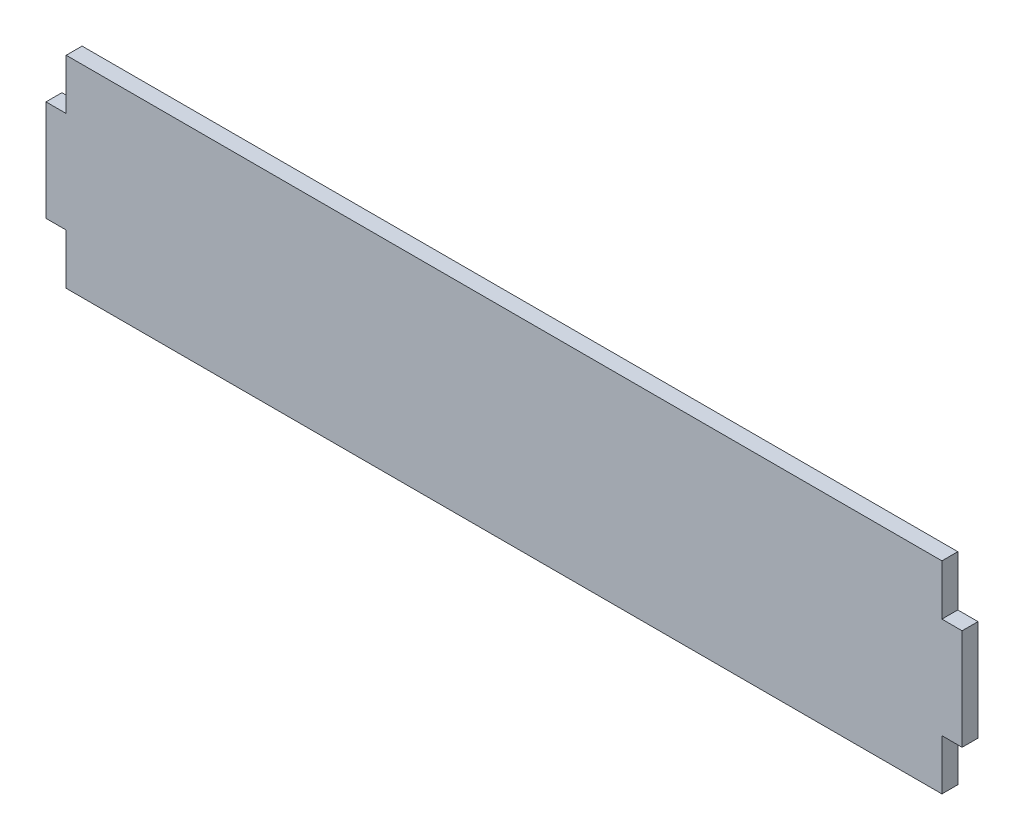
ISO-10303-21;
HEADER;
FILE_DESCRIPTION(('STEP AP214'),'2;1');
FILE_NAME('part.step','',(''),(''),'','','');
FILE_SCHEMA(('AUTOMOTIVE_DESIGN { 1 0 10303 214 1 1 1 1 }'));
ENDSEC;
DATA;
#1=APPLICATION_CONTEXT('core data for automotive mechanical design processes');
#2=APPLICATION_PROTOCOL_DEFINITION('international standard','automotive_design',2000,#1);
#3=PRODUCT_CONTEXT('',#1,'mechanical');
#4=PRODUCT('Part','Part','',(#3));
#5=PRODUCT_RELATED_PRODUCT_CATEGORY('part','',(#4));
#6=PRODUCT_DEFINITION_FORMATION('','',#4);
#7=PRODUCT_DEFINITION_CONTEXT('part definition',#1,'design');
#8=PRODUCT_DEFINITION('design','',#6,#7);
#9=PRODUCT_DEFINITION_SHAPE('','',#8);
#10=(LENGTH_UNIT() NAMED_UNIT(*) SI_UNIT(.MILLI.,.METRE.));
#11=(NAMED_UNIT(*) PLANE_ANGLE_UNIT() SI_UNIT($,.RADIAN.));
#12=(NAMED_UNIT(*) SI_UNIT($,.STERADIAN.) SOLID_ANGLE_UNIT());
#13=UNCERTAINTY_MEASURE_WITH_UNIT(LENGTH_MEASURE(1.E-05),#10,'distance_accuracy_value','');
#14=(GEOMETRIC_REPRESENTATION_CONTEXT(3) GLOBAL_UNCERTAINTY_ASSIGNED_CONTEXT((#13)) GLOBAL_UNIT_ASSIGNED_CONTEXT((#10,
#11,#12)) REPRESENTATION_CONTEXT('',''));
#15=CARTESIAN_POINT('',(0.,0.,0.));
#16=DIRECTION('',(0.,0.,1.));
#17=DIRECTION('',(1.,0.,0.));
#18=AXIS2_PLACEMENT_3D('',#15,#16,#17);
#19=CARTESIAN_POINT('',(-75.3382959521356,22.86,2.));
#20=DIRECTION('',(1.,0.,0.));
#21=DIRECTION('',(0.,0.,-1.));
#22=AXIS2_PLACEMENT_3D('',#19,#20,#21);
#23=PLANE('',#22);
#24=DIRECTION('',(0.,-1.,0.));
#25=VECTOR('',#24,1.);
#26=CARTESIAN_POINT('',(-75.3382959521356,22.86,0.));
#27=LINE('',#26,#25);
#28=CARTESIAN_POINT('',(-75.3382959521356,25.4,0.));
#29=VERTEX_POINT('',#28);
#30=CARTESIAN_POINT('',(-75.3382959521356,19.05,0.));
#31=VERTEX_POINT('',#30);
#32=EDGE_CURVE('E104',#29,#31,#27,.T.);
#33=ORIENTED_EDGE('',*,*,#32,.T.);
#34=DIRECTION('',(0.,0.,-1.));
#35=VECTOR('',#34,1.);
#36=CARTESIAN_POINT('',(-75.3382959521356,19.05,2.));
#37=LINE('',#36,#35);
#38=CARTESIAN_POINT('',(-75.3382959521356,19.05,2.));
#39=VERTEX_POINT('',#38);
#40=EDGE_CURVE('E11',#39,#31,#37,.T.);
#41=ORIENTED_EDGE('',*,*,#40,.F.);
#42=DIRECTION('',(0.,-1.,0.));
#43=VECTOR('',#42,1.);
#44=CARTESIAN_POINT('',(-75.3382959521356,22.86,2.));
#45=LINE('',#44,#43);
#46=CARTESIAN_POINT('',(-75.3382959521356,25.4,2.));
#47=VERTEX_POINT('',#46);
#48=EDGE_CURVE('E110',#47,#39,#45,.T.);
#49=ORIENTED_EDGE('',*,*,#48,.F.);
#50=DIRECTION('',(0.,0.,-1.));
#51=VECTOR('',#50,1.);
#52=CARTESIAN_POINT('',(-75.3382959521356,25.4,2.));
#53=LINE('',#52,#51);
#54=EDGE_CURVE('E157',#47,#29,#53,.T.);
#55=ORIENTED_EDGE('',*,*,#54,.T.);
#56=EDGE_LOOP('',(#33,#41,#49,#55));
#57=FACE_BOUND('',#56,.T.);
#58=ADVANCED_FACE('F41',(#57),#23,.F.);
#59=CARTESIAN_POINT('',(-77.8782959521356,19.05,2.));
#60=DIRECTION('',(0.,-1.,0.));
#61=DIRECTION('',(0.,0.,-1.));
#62=AXIS2_PLACEMENT_3D('',#59,#60,#61);
#63=PLANE('',#62);
#64=DIRECTION('',(-1.,0.,0.));
#65=VECTOR('',#64,1.);
#66=CARTESIAN_POINT('',(-77.8782959521356,19.05,0.));
#67=LINE('',#66,#65);
#68=CARTESIAN_POINT('',(-77.8782959521356,19.05,0.));
#69=VERTEX_POINT('',#68);
#70=EDGE_CURVE('E162',#31,#69,#67,.T.);
#71=ORIENTED_EDGE('',*,*,#70,.T.);
#72=DIRECTION('',(0.,0.,-1.));
#73=VECTOR('',#72,1.);
#74=CARTESIAN_POINT('',(-77.8782959521356,19.05,2.));
#75=LINE('',#74,#73);
#76=CARTESIAN_POINT('',(-77.8782959521356,19.05,2.));
#77=VERTEX_POINT('',#76);
#78=EDGE_CURVE('E49',#77,#69,#75,.T.);
#79=ORIENTED_EDGE('',*,*,#78,.F.);
#80=DIRECTION('',(-1.,0.,0.));
#81=VECTOR('',#80,1.);
#82=CARTESIAN_POINT('',(-77.8782959521356,19.05,2.));
#83=LINE('',#82,#81);
#84=EDGE_CURVE('E251',#39,#77,#83,.T.);
#85=ORIENTED_EDGE('',*,*,#84,.F.);
#86=ORIENTED_EDGE('',*,*,#40,.T.);
#87=EDGE_LOOP('',(#71,#79,#85,#86));
#88=FACE_BOUND('',#87,.T.);
#89=ADVANCED_FACE('F254',(#88),#63,.F.);
#90=CARTESIAN_POINT('',(-77.8782959521356,19.05,2.));
#91=DIRECTION('',(1.,0.,0.));
#92=DIRECTION('',(0.,0.,-1.));
#93=AXIS2_PLACEMENT_3D('',#90,#91,#92);
#94=PLANE('',#93);
#95=DIRECTION('',(0.,-1.,0.));
#96=VECTOR('',#95,1.);
#97=CARTESIAN_POINT('',(-77.8782959521356,19.05,0.));
#98=LINE('',#97,#96);
#99=CARTESIAN_POINT('',(-77.8782959521356,6.35,0.));
#100=VERTEX_POINT('',#99);
#101=EDGE_CURVE('E164',#69,#100,#98,.T.);
#102=ORIENTED_EDGE('',*,*,#101,.T.);
#103=DIRECTION('',(0.,0.,-1.));
#104=VECTOR('',#103,1.);
#105=CARTESIAN_POINT('',(-77.8782959521356,6.35,2.));
#106=LINE('',#105,#104);
#107=CARTESIAN_POINT('',(-77.8782959521356,6.35,2.));
#108=VERTEX_POINT('',#107);
#109=EDGE_CURVE('E203',#108,#100,#106,.T.);
#110=ORIENTED_EDGE('',*,*,#109,.F.);
#111=DIRECTION('',(0.,-1.,0.));
#112=VECTOR('',#111,1.);
#113=CARTESIAN_POINT('',(-77.8782959521356,19.05,2.));
#114=LINE('',#113,#112);
#115=EDGE_CURVE('E212',#77,#108,#114,.T.);
#116=ORIENTED_EDGE('',*,*,#115,.F.);
#117=ORIENTED_EDGE('',*,*,#78,.T.);
#118=EDGE_LOOP('',(#102,#110,#116,#117));
#119=FACE_BOUND('',#118,.T.);
#120=ADVANCED_FACE('F210',(#119),#94,.F.);
#121=CARTESIAN_POINT('',(-77.8782959521356,6.35,2.));
#122=DIRECTION('',(0.,1.,0.));
#123=DIRECTION('',(-1.,0.,0.));
#124=AXIS2_PLACEMENT_3D('',#121,#122,#123);
#125=PLANE('',#124);
#126=DIRECTION('',(1.,0.,0.));
#127=VECTOR('',#126,1.);
#128=CARTESIAN_POINT('',(-77.8782959521356,6.35,0.));
#129=LINE('',#128,#127);
#130=CARTESIAN_POINT('',(-75.3382959521356,6.35,0.));
#131=VERTEX_POINT('',#130);
#132=EDGE_CURVE('E166',#100,#131,#129,.T.);
#133=ORIENTED_EDGE('',*,*,#132,.T.);
#134=DIRECTION('',(0.,0.,-1.));
#135=VECTOR('',#134,1.);
#136=CARTESIAN_POINT('',(-75.3382959521356,6.35,2.));
#137=LINE('',#136,#135);
#138=CARTESIAN_POINT('',(-75.3382959521356,6.35,2.));
#139=VERTEX_POINT('',#138);
#140=EDGE_CURVE('E200',#139,#131,#137,.T.);
#141=ORIENTED_EDGE('',*,*,#140,.F.);
#142=DIRECTION('',(1.,0.,0.));
#143=VECTOR('',#142,1.);
#144=CARTESIAN_POINT('',(-77.8782959521356,6.35,2.));
#145=LINE('',#144,#143);
#146=EDGE_CURVE('E229',#108,#139,#145,.T.);
#147=ORIENTED_EDGE('',*,*,#146,.F.);
#148=ORIENTED_EDGE('',*,*,#109,.T.);
#149=EDGE_LOOP('',(#133,#141,#147,#148));
#150=FACE_BOUND('',#149,.T.);
#151=ADVANCED_FACE('F220',(#150),#125,.F.);
#152=CARTESIAN_POINT('',(-75.3382959521356,2.54,2.));
#153=DIRECTION('',(1.,0.,0.));
#154=DIRECTION('',(0.,0.,-1.));
#155=AXIS2_PLACEMENT_3D('',#152,#153,#154);
#156=PLANE('',#155);
#157=DIRECTION('',(0.,-1.,0.));
#158=VECTOR('',#157,1.);
#159=CARTESIAN_POINT('',(-75.3382959521356,2.54,0.));
#160=LINE('',#159,#158);
#161=CARTESIAN_POINT('',(-75.3382959521356,0.,0.));
#162=VERTEX_POINT('',#161);
#163=EDGE_CURVE('E169',#131,#162,#160,.T.);
#164=ORIENTED_EDGE('',*,*,#163,.T.);
#165=DIRECTION('',(0.,0.,-1.));
#166=VECTOR('',#165,1.);
#167=CARTESIAN_POINT('',(-75.3382959521356,0.,2.));
#168=LINE('',#167,#166);
#169=CARTESIAN_POINT('',(-75.3382959521356,0.,2.));
#170=VERTEX_POINT('',#169);
#171=EDGE_CURVE('E197',#170,#162,#168,.T.);
#172=ORIENTED_EDGE('',*,*,#171,.F.);
#173=DIRECTION('',(0.,-1.,0.));
#174=VECTOR('',#173,1.);
#175=CARTESIAN_POINT('',(-75.3382959521356,6.35,2.));
#176=LINE('',#175,#174);
#177=EDGE_CURVE('E226',#139,#170,#176,.T.);
#178=ORIENTED_EDGE('',*,*,#177,.F.);
#179=ORIENTED_EDGE('',*,*,#140,.T.);
#180=EDGE_LOOP('',(#164,#172,#178,#179));
#181=FACE_BOUND('',#180,.T.);
#182=ADVANCED_FACE('F224',(#181),#156,.F.);
#183=CARTESIAN_POINT('',(-75.3382959521356,0.,2.));
#184=DIRECTION('',(0.,1.,0.));
#185=DIRECTION('',(-1.,0.,0.));
#186=AXIS2_PLACEMENT_3D('',#183,#184,#185);
#187=PLANE('',#186);
#188=DIRECTION('',(1.,0.,0.));
#189=VECTOR('',#188,1.);
#190=CARTESIAN_POINT('',(-75.3382959521356,0.,0.));
#191=LINE('',#190,#189);
#192=CARTESIAN_POINT('',(34.8456307692308,0.,0.));
#193=VERTEX_POINT('',#192);
#194=EDGE_CURVE('E171',#162,#193,#191,.T.);
#195=ORIENTED_EDGE('',*,*,#194,.T.);
#196=DIRECTION('',(0.,0.,-1.));
#197=VECTOR('',#196,1.);
#198=CARTESIAN_POINT('',(34.8456307692308,0.,2.));
#199=LINE('',#198,#197);
#200=CARTESIAN_POINT('',(34.8456307692308,0.,2.));
#201=VERTEX_POINT('',#200);
#202=EDGE_CURVE('E194',#201,#193,#199,.T.);
#203=ORIENTED_EDGE('',*,*,#202,.F.);
#204=DIRECTION('',(1.,0.,0.));
#205=VECTOR('',#204,1.);
#206=CARTESIAN_POINT('',(-75.3382959521356,0.,2.));
#207=LINE('',#206,#205);
#208=EDGE_CURVE('E228',#170,#201,#207,.T.);
#209=ORIENTED_EDGE('',*,*,#208,.F.);
#210=ORIENTED_EDGE('',*,*,#171,.T.);
#211=EDGE_LOOP('',(#195,#203,#209,#210));
#212=FACE_BOUND('',#211,.T.);
#213=ADVANCED_FACE('F266',(#212),#187,.F.);
#214=CARTESIAN_POINT('',(34.8456307692308,6.35,2.));
#215=DIRECTION('',(-1.,0.,0.));
#216=DIRECTION('',(0.,0.,1.));
#217=AXIS2_PLACEMENT_3D('',#214,#215,#216);
#218=PLANE('',#217);
#219=DIRECTION('',(0.,1.,0.));
#220=VECTOR('',#219,1.);
#221=CARTESIAN_POINT('',(34.8456307692308,6.35,0.));
#222=LINE('',#221,#220);
#223=CARTESIAN_POINT('',(34.8456307692308,6.35,0.));
#224=VERTEX_POINT('',#223);
#225=EDGE_CURVE('E174',#193,#224,#222,.T.);
#226=ORIENTED_EDGE('',*,*,#225,.T.);
#227=DIRECTION('',(0.,0.,-1.));
#228=VECTOR('',#227,1.);
#229=CARTESIAN_POINT('',(34.8456307692308,6.35,2.));
#230=LINE('',#229,#228);
#231=CARTESIAN_POINT('',(34.8456307692308,6.35,2.));
#232=VERTEX_POINT('',#231);
#233=EDGE_CURVE('E191',#232,#224,#230,.T.);
#234=ORIENTED_EDGE('',*,*,#233,.F.);
#235=DIRECTION('',(0.,1.,0.));
#236=VECTOR('',#235,1.);
#237=CARTESIAN_POINT('',(34.8456307692308,2.54,2.));
#238=LINE('',#237,#236);
#239=EDGE_CURVE('E231',#201,#232,#238,.T.);
#240=ORIENTED_EDGE('',*,*,#239,.F.);
#241=ORIENTED_EDGE('',*,*,#202,.T.);
#242=EDGE_LOOP('',(#226,#234,#240,#241));
#243=FACE_BOUND('',#242,.T.);
#244=ADVANCED_FACE('F269',(#243),#218,.F.);
#245=CARTESIAN_POINT('',(34.8456307692308,6.35,2.));
#246=DIRECTION('',(0.,1.,0.));
#247=DIRECTION('',(-1.,0.,0.));
#248=AXIS2_PLACEMENT_3D('',#245,#246,#247);
#249=PLANE('',#248);
#250=DIRECTION('',(1.,0.,0.));
#251=VECTOR('',#250,1.);
#252=CARTESIAN_POINT('',(34.8456307692308,6.35,0.));
#253=LINE('',#252,#251);
#254=CARTESIAN_POINT('',(37.3856307692308,6.35,0.));
#255=VERTEX_POINT('',#254);
#256=EDGE_CURVE('E176',#224,#255,#253,.T.);
#257=ORIENTED_EDGE('',*,*,#256,.T.);
#258=DIRECTION('',(0.,0.,-1.));
#259=VECTOR('',#258,1.);
#260=CARTESIAN_POINT('',(37.3856307692308,6.35,2.));
#261=LINE('',#260,#259);
#262=CARTESIAN_POINT('',(37.3856307692308,6.35,2.));
#263=VERTEX_POINT('',#262);
#264=EDGE_CURVE('E188',#263,#255,#261,.T.);
#265=ORIENTED_EDGE('',*,*,#264,.F.);
#266=DIRECTION('',(1.,0.,0.));
#267=VECTOR('',#266,1.);
#268=CARTESIAN_POINT('',(34.8456307692308,6.35,2.));
#269=LINE('',#268,#267);
#270=EDGE_CURVE('E237',#232,#263,#269,.T.);
#271=ORIENTED_EDGE('',*,*,#270,.F.);
#272=ORIENTED_EDGE('',*,*,#233,.T.);
#273=EDGE_LOOP('',(#257,#265,#271,#272));
#274=FACE_BOUND('',#273,.T.);
#275=ADVANCED_FACE('F243',(#274),#249,.F.);
#276=CARTESIAN_POINT('',(37.3856307692308,19.05,2.));
#277=DIRECTION('',(-1.,0.,0.));
#278=DIRECTION('',(0.,0.,1.));
#279=AXIS2_PLACEMENT_3D('',#276,#277,#278);
#280=PLANE('',#279);
#281=DIRECTION('',(0.,1.,0.));
#282=VECTOR('',#281,1.);
#283=CARTESIAN_POINT('',(37.3856307692308,19.05,0.));
#284=LINE('',#283,#282);
#285=CARTESIAN_POINT('',(37.3856307692308,19.05,0.));
#286=VERTEX_POINT('',#285);
#287=EDGE_CURVE('E178',#255,#286,#284,.T.);
#288=ORIENTED_EDGE('',*,*,#287,.T.);
#289=DIRECTION('',(0.,0.,-1.));
#290=VECTOR('',#289,1.);
#291=CARTESIAN_POINT('',(37.3856307692308,19.05,2.));
#292=LINE('',#291,#290);
#293=CARTESIAN_POINT('',(37.3856307692308,19.05,2.));
#294=VERTEX_POINT('',#293);
#295=EDGE_CURVE('E152',#294,#286,#292,.T.);
#296=ORIENTED_EDGE('',*,*,#295,.F.);
#297=DIRECTION('',(0.,1.,0.));
#298=VECTOR('',#297,1.);
#299=CARTESIAN_POINT('',(37.3856307692308,19.05,2.));
#300=LINE('',#299,#298);
#301=EDGE_CURVE('E142',#263,#294,#300,.T.);
#302=ORIENTED_EDGE('',*,*,#301,.F.);
#303=ORIENTED_EDGE('',*,*,#264,.T.);
#304=EDGE_LOOP('',(#288,#296,#302,#303));
#305=FACE_BOUND('',#304,.T.);
#306=ADVANCED_FACE('F247',(#305),#280,.F.);
#307=CARTESIAN_POINT('',(34.8456307692308,19.05,2.));
#308=DIRECTION('',(0.,-1.,0.));
#309=DIRECTION('',(0.,0.,-1.));
#310=AXIS2_PLACEMENT_3D('',#307,#308,#309);
#311=PLANE('',#310);
#312=DIRECTION('',(-1.,0.,0.));
#313=VECTOR('',#312,1.);
#314=CARTESIAN_POINT('',(34.8456307692308,19.05,0.));
#315=LINE('',#314,#313);
#316=CARTESIAN_POINT('',(34.8456307692308,19.05,0.));
#317=VERTEX_POINT('',#316);
#318=EDGE_CURVE('E151',#286,#317,#315,.T.);
#319=ORIENTED_EDGE('',*,*,#318,.T.);
#320=DIRECTION('',(0.,0.,-1.));
#321=VECTOR('',#320,1.);
#322=CARTESIAN_POINT('',(34.8456307692308,19.05,2.));
#323=LINE('',#322,#321);
#324=CARTESIAN_POINT('',(34.8456307692308,19.05,2.));
#325=VERTEX_POINT('',#324);
#326=EDGE_CURVE('E148',#325,#317,#323,.T.);
#327=ORIENTED_EDGE('',*,*,#326,.F.);
#328=DIRECTION('',(-1.,0.,0.));
#329=VECTOR('',#328,1.);
#330=CARTESIAN_POINT('',(34.8456307692308,19.05,2.));
#331=LINE('',#330,#329);
#332=EDGE_CURVE('E136',#294,#325,#331,.T.);
#333=ORIENTED_EDGE('',*,*,#332,.F.);
#334=ORIENTED_EDGE('',*,*,#295,.T.);
#335=EDGE_LOOP('',(#319,#327,#333,#334));
#336=FACE_BOUND('',#335,.T.);
#337=ADVANCED_FACE('F149',(#336),#311,.F.);
#338=CARTESIAN_POINT('',(34.8456307692308,22.86,2.));
#339=DIRECTION('',(-1.,0.,0.));
#340=DIRECTION('',(0.,0.,1.));
#341=AXIS2_PLACEMENT_3D('',#338,#339,#340);
#342=PLANE('',#341);
#343=DIRECTION('',(0.,1.,0.));
#344=VECTOR('',#343,1.);
#345=CARTESIAN_POINT('',(34.8456307692308,22.86,0.));
#346=LINE('',#345,#344);
#347=CARTESIAN_POINT('',(34.8456307692308,25.4,0.));
#348=VERTEX_POINT('',#347);
#349=EDGE_CURVE('E97',#317,#348,#346,.T.);
#350=ORIENTED_EDGE('',*,*,#349,.T.);
#351=DIRECTION('',(0.,0.,-1.));
#352=VECTOR('',#351,1.);
#353=CARTESIAN_POINT('',(34.8456307692308,25.4,2.));
#354=LINE('',#353,#352);
#355=CARTESIAN_POINT('',(34.8456307692308,25.4,2.));
#356=VERTEX_POINT('',#355);
#357=EDGE_CURVE('E153',#356,#348,#354,.T.);
#358=ORIENTED_EDGE('',*,*,#357,.F.);
#359=DIRECTION('',(0.,1.,0.));
#360=VECTOR('',#359,1.);
#361=CARTESIAN_POINT('',(34.8456307692308,22.86,2.));
#362=LINE('',#361,#360);
#363=EDGE_CURVE('E140',#325,#356,#362,.T.);
#364=ORIENTED_EDGE('',*,*,#363,.F.);
#365=ORIENTED_EDGE('',*,*,#326,.T.);
#366=EDGE_LOOP('',(#350,#358,#364,#365));
#367=FACE_BOUND('',#366,.T.);
#368=ADVANCED_FACE('F155',(#367),#342,.F.);
#369=CARTESIAN_POINT('',(-75.3382959521356,25.4,2.));
#370=DIRECTION('',(0.,-1.,0.));
#371=DIRECTION('',(0.,0.,-1.));
#372=AXIS2_PLACEMENT_3D('',#369,#370,#371);
#373=PLANE('',#372);
#374=DIRECTION('',(-1.,0.,0.));
#375=VECTOR('',#374,1.);
#376=CARTESIAN_POINT('',(-75.3382959521356,25.4,0.));
#377=LINE('',#376,#375);
#378=EDGE_CURVE('E182',#348,#29,#377,.T.);
#379=ORIENTED_EDGE('',*,*,#378,.T.);
#380=ORIENTED_EDGE('',*,*,#54,.F.);
#381=DIRECTION('',(-1.,0.,0.));
#382=VECTOR('',#381,1.);
#383=CARTESIAN_POINT('',(-75.3382959521356,25.4,2.));
#384=LINE('',#383,#382);
#385=EDGE_CURVE('E57',#356,#47,#384,.T.);
#386=ORIENTED_EDGE('',*,*,#385,.F.);
#387=ORIENTED_EDGE('',*,*,#357,.T.);
#388=EDGE_LOOP('',(#379,#380,#386,#387));
#389=FACE_BOUND('',#388,.T.);
#390=ADVANCED_FACE('F249',(#389),#373,.F.);
#391=CARTESIAN_POINT('',(0.,0.,2.));
#392=DIRECTION('',(0.,0.,-1.));
#393=DIRECTION('',(-1.,0.,0.));
#394=AXIS2_PLACEMENT_3D('',#391,#392,#393);
#395=PLANE('',#394);
#396=ORIENTED_EDGE('',*,*,#48,.T.);
#397=ORIENTED_EDGE('',*,*,#84,.T.);
#398=ORIENTED_EDGE('',*,*,#115,.T.);
#399=ORIENTED_EDGE('',*,*,#146,.T.);
#400=ORIENTED_EDGE('',*,*,#177,.T.);
#401=ORIENTED_EDGE('',*,*,#208,.T.);
#402=ORIENTED_EDGE('',*,*,#239,.T.);
#403=ORIENTED_EDGE('',*,*,#270,.T.);
#404=ORIENTED_EDGE('',*,*,#301,.T.);
#405=ORIENTED_EDGE('',*,*,#332,.T.);
#406=ORIENTED_EDGE('',*,*,#363,.T.);
#407=ORIENTED_EDGE('',*,*,#385,.T.);
#408=EDGE_LOOP('',(#396,#397,#398,#399,#400,#401,#402,#403,#404,#405,#406,#407));
#409=FACE_BOUND('',#408,.T.);
#410=ADVANCED_FACE('F138',(#409),#395,.F.);
#411=CARTESIAN_POINT('',(0.,0.,0.));
#412=DIRECTION('',(0.,0.,-1.));
#413=DIRECTION('',(-1.,0.,0.));
#414=AXIS2_PLACEMENT_3D('',#411,#412,#413);
#415=PLANE('',#414);
#416=ORIENTED_EDGE('',*,*,#32,.F.);
#417=ORIENTED_EDGE('',*,*,#378,.F.);
#418=ORIENTED_EDGE('',*,*,#349,.F.);
#419=ORIENTED_EDGE('',*,*,#318,.F.);
#420=ORIENTED_EDGE('',*,*,#287,.F.);
#421=ORIENTED_EDGE('',*,*,#256,.F.);
#422=ORIENTED_EDGE('',*,*,#225,.F.);
#423=ORIENTED_EDGE('',*,*,#194,.F.);
#424=ORIENTED_EDGE('',*,*,#163,.F.);
#425=ORIENTED_EDGE('',*,*,#132,.F.);
#426=ORIENTED_EDGE('',*,*,#101,.F.);
#427=ORIENTED_EDGE('',*,*,#70,.F.);
#428=EDGE_LOOP('',(#416,#417,#418,#419,#420,#421,#422,#423,#424,#425,#426,#427));
#429=FACE_BOUND('',#428,.T.);
#430=ADVANCED_FACE('F216',(#429),#415,.T.);
#431=CLOSED_SHELL('',(#58,#89,#120,#151,#182,#213,#244,#275,#306,#337,#368,#390,#410,#430));
#432=MANIFOLD_SOLID_BREP('B2',#431);
#433=ADVANCED_BREP_SHAPE_REPRESENTATION('',(#18,#432),#14);
#434=SHAPE_DEFINITION_REPRESENTATION(#9,#433);
ENDSEC;
END-ISO-10303-21;
